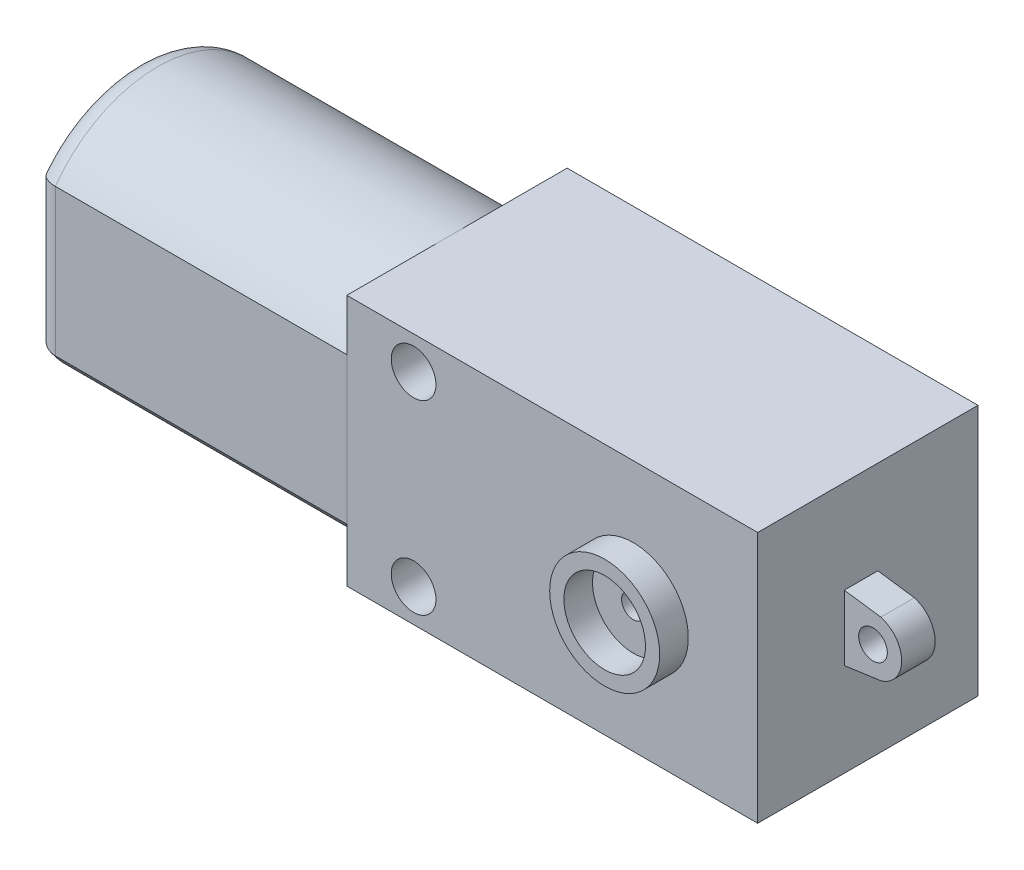
ISO-10303-21;
HEADER;
FILE_DESCRIPTION(('STEP AP214'),'2;1');
FILE_NAME('part.step','',(''),(''),'','','');
FILE_SCHEMA(('AUTOMOTIVE_DESIGN { 1 0 10303 214 1 1 1 1 }'));
ENDSEC;
DATA;
#1=APPLICATION_CONTEXT('core data for automotive mechanical design processes');
#2=APPLICATION_PROTOCOL_DEFINITION('international standard','automotive_design',2000,#1);
#3=PRODUCT_CONTEXT('',#1,'mechanical');
#4=PRODUCT('Part','Part','',(#3));
#5=PRODUCT_RELATED_PRODUCT_CATEGORY('part','',(#4));
#6=PRODUCT_DEFINITION_FORMATION('','',#4);
#7=PRODUCT_DEFINITION_CONTEXT('part definition',#1,'design');
#8=PRODUCT_DEFINITION('design','',#6,#7);
#9=PRODUCT_DEFINITION_SHAPE('','',#8);
#10=(LENGTH_UNIT() NAMED_UNIT(*) SI_UNIT(.MILLI.,.METRE.));
#11=(NAMED_UNIT(*) PLANE_ANGLE_UNIT() SI_UNIT($,.RADIAN.));
#12=(NAMED_UNIT(*) SI_UNIT($,.STERADIAN.) SOLID_ANGLE_UNIT());
#13=UNCERTAINTY_MEASURE_WITH_UNIT(LENGTH_MEASURE(1.E-05),#10,'distance_accuracy_value','');
#14=(GEOMETRIC_REPRESENTATION_CONTEXT(3) GLOBAL_UNCERTAINTY_ASSIGNED_CONTEXT((#13)) GLOBAL_UNIT_ASSIGNED_CONTEXT((#10,
#11,#12)) REPRESENTATION_CONTEXT('',''));
#15=CARTESIAN_POINT('',(0.,0.,0.));
#16=DIRECTION('',(0.,0.,1.));
#17=DIRECTION('',(1.,0.,0.));
#18=AXIS2_PLACEMENT_3D('',#15,#16,#17);
#19=CARTESIAN_POINT('',(-27.94,0.,0.));
#20=DIRECTION('',(-1.,0.,0.));
#21=DIRECTION('',(0.,0.,1.));
#22=AXIS2_PLACEMENT_3D('',#19,#20,#21);
#23=PLANE('',#22);
#24=CARTESIAN_POINT('',(-27.94,0.,0.));
#25=DIRECTION('',(-1.,0.,0.));
#26=DIRECTION('',(0.,0.,1.));
#27=AXIS2_PLACEMENT_3D('',#24,#25,#26);
#28=CIRCLE('',#27,9.1633);
#29=CARTESIAN_POINT('',(-27.94,5.83006436756919,7.0694));
#30=VERTEX_POINT('',#29);
#31=CARTESIAN_POINT('',(-27.94,5.70664266710296,-7.1694));
#32=VERTEX_POINT('',#31);
#33=EDGE_CURVE('E470',#30,#32,#28,.T.);
#34=ORIENTED_EDGE('',*,*,#33,.T.);
#35=DIRECTION('',(0.,-1.,0.));
#36=VECTOR('',#35,1.);
#37=CARTESIAN_POINT('',(-27.94,-6.36721057685389,-7.1694));
#38=LINE('',#37,#36);
#39=CARTESIAN_POINT('',(-27.94,-5.70664266710296,-7.1694));
#40=VERTEX_POINT('',#39);
#41=EDGE_CURVE('E253',#32,#40,#38,.T.);
#42=ORIENTED_EDGE('',*,*,#41,.T.);
#43=CARTESIAN_POINT('',(-27.94,0.,0.));
#44=DIRECTION('',(-1.,0.,0.));
#45=DIRECTION('',(0.,0.,1.));
#46=AXIS2_PLACEMENT_3D('',#43,#44,#45);
#47=CIRCLE('',#46,9.1633);
#48=CARTESIAN_POINT('',(-27.94,-5.83006436756919,7.0694));
#49=VERTEX_POINT('',#48);
#50=EDGE_CURVE('E462',#40,#49,#47,.T.);
#51=ORIENTED_EDGE('',*,*,#50,.T.);
#52=DIRECTION('',(0.,1.,0.));
#53=VECTOR('',#52,1.);
#54=CARTESIAN_POINT('',(-27.94,0.,7.0694));
#55=LINE('',#54,#53);
#56=EDGE_CURVE('E465',#49,#30,#55,.T.);
#57=ORIENTED_EDGE('',*,*,#56,.T.);
#58=EDGE_LOOP('',(#34,#42,#51,#57));
#59=FACE_BOUND('',#58,.T.);
#60=CARTESIAN_POINT('',(-27.94,0.,0.));
#61=DIRECTION('',(-1.,0.,0.));
#62=DIRECTION('',(0.,0.,1.));
#63=AXIS2_PLACEMENT_3D('',#60,#61,#62);
#64=CIRCLE('',#63,2.69917026626449);
#65=CARTESIAN_POINT('',(-27.94,0.,2.69917026626449));
#66=VERTEX_POINT('',#65);
#67=EDGE_CURVE('E461',#66,#66,#64,.F.);
#68=ORIENTED_EDGE('',*,*,#67,.T.);
#69=EDGE_LOOP('',(#68));
#70=FACE_BOUND('',#69,.T.);
#71=ADVANCED_FACE('F88',(#59,#70),#23,.T.);
#72=CARTESIAN_POINT('',(-27.94,0.,0.));
#73=DIRECTION('',(1.,0.,0.));
#74=DIRECTION('',(0.,0.,-1.));
#75=AXIS2_PLACEMENT_3D('',#72,#73,#74);
#76=CYLINDRICAL_SURFACE('',#75,11.1633);
#77=DIRECTION('',(1.,0.,0.));
#78=VECTOR('',#77,1.);
#79=CARTESIAN_POINT('',(-27.94,-6.50885938778831,9.0694));
#80=LINE('',#79,#78);
#81=CARTESIAN_POINT('',(-25.94,-6.50885938778831,9.0694));
#82=VERTEX_POINT('',#81);
#83=CARTESIAN_POINT('',(0.,-6.50885938778831,9.0694));
#84=VERTEX_POINT('',#83);
#85=EDGE_CURVE('E199',#82,#84,#80,.T.);
#86=ORIENTED_EDGE('',*,*,#85,.F.);
#87=CARTESIAN_POINT('',(-25.94,0.,0.));
#88=DIRECTION('',(-1.,0.,0.));
#89=DIRECTION('',(0.,0.,1.));
#90=AXIS2_PLACEMENT_3D('',#87,#88,#89);
#91=CIRCLE('',#90,11.1633);
#92=CARTESIAN_POINT('',(-25.94,-6.36721057685389,-9.1694));
#93=VERTEX_POINT('',#92);
#94=EDGE_CURVE('E12',#82,#93,#91,.F.);
#95=ORIENTED_EDGE('',*,*,#94,.T.);
#96=DIRECTION('',(1.,0.,0.));
#97=VECTOR('',#96,1.);
#98=CARTESIAN_POINT('',(-27.94,-6.36721057685389,-9.1694));
#99=LINE('',#98,#97);
#100=CARTESIAN_POINT('',(0.,-6.36721057685388,-9.1694));
#101=VERTEX_POINT('',#100);
#102=EDGE_CURVE('E249',#93,#101,#99,.T.);
#103=ORIENTED_EDGE('',*,*,#102,.T.);
#104=CARTESIAN_POINT('',(0.,0.,0.));
#105=DIRECTION('',(-1.,0.,0.));
#106=DIRECTION('',(0.,0.,1.));
#107=AXIS2_PLACEMENT_3D('',#104,#105,#106);
#108=CIRCLE('',#107,11.1633);
#109=CARTESIAN_POINT('',(0.,-11.1633,0.));
#110=VERTEX_POINT('',#109);
#111=EDGE_CURVE('E222',#101,#110,#108,.T.);
#112=ORIENTED_EDGE('',*,*,#111,.T.);
#113=EDGE_CURVE('E214',#110,#84,#108,.T.);
#114=ORIENTED_EDGE('',*,*,#113,.T.);
#115=EDGE_LOOP('',(#86,#95,#103,#112,#114));
#116=FACE_BOUND('',#115,.T.);
#117=ADVANCED_FACE('F220',(#116),#76,.T.);
#118=CARTESIAN_POINT('',(-27.94,0.,0.));
#119=DIRECTION('',(1.,0.,0.));
#120=DIRECTION('',(0.,0.,-1.));
#121=AXIS2_PLACEMENT_3D('',#118,#119,#120);
#122=CYLINDRICAL_SURFACE('',#121,11.1633);
#123=DIRECTION('',(1.,0.,0.));
#124=VECTOR('',#123,1.);
#125=CARTESIAN_POINT('',(-27.94,6.36721057685389,-9.1694));
#126=LINE('',#125,#124);
#127=CARTESIAN_POINT('',(-25.94,6.36721057685389,-9.1694));
#128=VERTEX_POINT('',#127);
#129=CARTESIAN_POINT('',(0.,6.36721057685389,-9.1694));
#130=VERTEX_POINT('',#129);
#131=EDGE_CURVE('E252',#128,#130,#126,.T.);
#132=ORIENTED_EDGE('',*,*,#131,.F.);
#133=CARTESIAN_POINT('',(-25.94,0.,0.));
#134=DIRECTION('',(-1.,0.,0.));
#135=DIRECTION('',(0.,0.,1.));
#136=AXIS2_PLACEMENT_3D('',#133,#134,#135);
#137=CIRCLE('',#136,11.1633);
#138=CARTESIAN_POINT('',(-25.94,6.50885938778831,9.0694));
#139=VERTEX_POINT('',#138);
#140=EDGE_CURVE('E117',#128,#139,#137,.F.);
#141=ORIENTED_EDGE('',*,*,#140,.T.);
#142=DIRECTION('',(1.,0.,0.));
#143=VECTOR('',#142,1.);
#144=CARTESIAN_POINT('',(-27.94,6.50885938778831,9.0694));
#145=LINE('',#144,#143);
#146=CARTESIAN_POINT('',(0.,6.50885938778831,9.0694));
#147=VERTEX_POINT('',#146);
#148=EDGE_CURVE('E463',#147,#139,#145,.F.);
#149=ORIENTED_EDGE('',*,*,#148,.F.);
#150=CARTESIAN_POINT('',(0.,0.,0.));
#151=DIRECTION('',(-1.,0.,0.));
#152=DIRECTION('',(0.,0.,1.));
#153=AXIS2_PLACEMENT_3D('',#150,#151,#152);
#154=CIRCLE('',#153,11.1633);
#155=CARTESIAN_POINT('',(0.,11.1633,0.));
#156=VERTEX_POINT('',#155);
#157=EDGE_CURVE('E217',#147,#156,#154,.T.);
#158=ORIENTED_EDGE('',*,*,#157,.T.);
#159=EDGE_CURVE('E224',#156,#130,#154,.T.);
#160=ORIENTED_EDGE('',*,*,#159,.T.);
#161=EDGE_LOOP('',(#132,#141,#149,#158,#160));
#162=FACE_BOUND('',#161,.T.);
#163=ADVANCED_FACE('F309',(#162),#122,.T.);
#164=CARTESIAN_POINT('',(36.4236,-11.1633,-10.3632));
#165=DIRECTION('',(0.,0.,-1.));
#166=DIRECTION('',(-1.,0.,0.));
#167=AXIS2_PLACEMENT_3D('',#164,#165,#166);
#168=PLANE('',#167);
#169=DIRECTION('',(0.,-1.,0.));
#170=VECTOR('',#169,1.);
#171=CARTESIAN_POINT('',(36.4236,11.1633,-10.3632));
#172=LINE('',#171,#170);
#173=CARTESIAN_POINT('',(36.4236,11.1633,-10.3632));
#174=VERTEX_POINT('',#173);
#175=CARTESIAN_POINT('',(36.4236,-11.1633,-10.3632));
#176=VERTEX_POINT('',#175);
#177=EDGE_CURVE('E524',#174,#176,#172,.T.);
#178=ORIENTED_EDGE('',*,*,#177,.T.);
#179=DIRECTION('',(-1.,0.,0.));
#180=VECTOR('',#179,1.);
#181=CARTESIAN_POINT('',(36.4236,-11.1633,-10.3632));
#182=LINE('',#181,#180);
#183=CARTESIAN_POINT('',(0.,-11.1633,-10.3632));
#184=VERTEX_POINT('',#183);
#185=EDGE_CURVE('E521',#176,#184,#182,.T.);
#186=ORIENTED_EDGE('',*,*,#185,.T.);
#187=DIRECTION('',(0.,1.,0.));
#188=VECTOR('',#187,1.);
#189=CARTESIAN_POINT('',(0.,11.1633,-10.3632));
#190=LINE('',#189,#188);
#191=CARTESIAN_POINT('',(0.,11.1633,-10.3632));
#192=VERTEX_POINT('',#191);
#193=EDGE_CURVE('E515',#184,#192,#190,.T.);
#194=ORIENTED_EDGE('',*,*,#193,.T.);
#195=DIRECTION('',(1.,0.,0.));
#196=VECTOR('',#195,1.);
#197=CARTESIAN_POINT('',(36.4236,11.1633,-10.3632));
#198=LINE('',#197,#196);
#199=EDGE_CURVE('E491',#192,#174,#198,.T.);
#200=ORIENTED_EDGE('',*,*,#199,.T.);
#201=EDGE_LOOP('',(#178,#186,#194,#200));
#202=FACE_BOUND('',#201,.T.);
#203=CARTESIAN_POINT('',(25.4,0.,-10.3632));
#204=DIRECTION('',(0.,0.,-1.));
#205=DIRECTION('',(-1.,0.,0.));
#206=AXIS2_PLACEMENT_3D('',#203,#204,#205);
#207=CIRCLE('',#206,1.0414);
#208=CARTESIAN_POINT('',(24.3586,0.,-10.3632));
#209=VERTEX_POINT('',#208);
#210=EDGE_CURVE('E528',#209,#209,#207,.F.);
#211=ORIENTED_EDGE('',*,*,#210,.T.);
#212=EDGE_LOOP('',(#211));
#213=FACE_BOUND('',#212,.T.);
#214=CARTESIAN_POINT('',(5.9182,8.2423,-10.3632));
#215=DIRECTION('',(0.,0.,-1.));
#216=DIRECTION('',(-1.,0.,0.));
#217=AXIS2_PLACEMENT_3D('',#214,#215,#216);
#218=CIRCLE('',#217,1.9812);
#219=CARTESIAN_POINT('',(3.937,8.2423,-10.3632));
#220=VERTEX_POINT('',#219);
#221=EDGE_CURVE('E534',#220,#220,#218,.F.);
#222=ORIENTED_EDGE('',*,*,#221,.T.);
#223=EDGE_LOOP('',(#222));
#224=FACE_BOUND('',#223,.T.);
#225=CARTESIAN_POINT('',(5.9182,-8.2423,-10.3632));
#226=DIRECTION('',(0.,0.,-1.));
#227=DIRECTION('',(-1.,0.,0.));
#228=AXIS2_PLACEMENT_3D('',#225,#226,#227);
#229=CIRCLE('',#228,1.9812);
#230=CARTESIAN_POINT('',(3.937,-8.2423,-10.3632));
#231=VERTEX_POINT('',#230);
#232=EDGE_CURVE('E538',#231,#231,#229,.F.);
#233=ORIENTED_EDGE('',*,*,#232,.T.);
#234=EDGE_LOOP('',(#233));
#235=FACE_BOUND('',#234,.T.);
#236=CARTESIAN_POINT('',(14.5542,0.,-10.3632));
#237=DIRECTION('',(0.,0.,-1.));
#238=DIRECTION('',(-1.,0.,0.));
#239=AXIS2_PLACEMENT_3D('',#236,#237,#238);
#240=CIRCLE('',#239,1.8542);
#241=CARTESIAN_POINT('',(12.7,0.,-10.3632));
#242=VERTEX_POINT('',#241);
#243=EDGE_CURVE('E206',#242,#242,#240,.T.);
#244=ORIENTED_EDGE('',*,*,#243,.F.);
#245=EDGE_LOOP('',(#244));
#246=FACE_BOUND('',#245,.T.);
#247=ADVANCED_FACE('F317',(#202,#213,#224,#235,#246),#168,.T.);
#248=CARTESIAN_POINT('',(36.4236,11.1633,-9.1694));
#249=DIRECTION('',(0.,0.,1.));
#250=DIRECTION('',(1.,0.,0.));
#251=AXIS2_PLACEMENT_3D('',#248,#249,#250);
#252=PLANE('',#251);
#253=ORIENTED_EDGE('',*,*,#102,.F.);
#254=DIRECTION('',(0.,-1.,0.));
#255=VECTOR('',#254,1.);
#256=CARTESIAN_POINT('',(-25.94,6.36721057685389,-9.1694));
#257=LINE('',#256,#255);
#258=EDGE_CURVE('E257',#93,#128,#257,.F.);
#259=ORIENTED_EDGE('',*,*,#258,.T.);
#260=ORIENTED_EDGE('',*,*,#131,.T.);
#261=DIRECTION('',(0.,1.,0.));
#262=VECTOR('',#261,1.);
#263=CARTESIAN_POINT('',(0.,11.1633,-9.1694));
#264=LINE('',#263,#262);
#265=EDGE_CURVE('E227',#101,#130,#264,.T.);
#266=ORIENTED_EDGE('',*,*,#265,.F.);
#267=EDGE_LOOP('',(#253,#259,#260,#266));
#268=FACE_BOUND('',#267,.T.);
#269=ADVANCED_FACE('F332',(#268),#252,.F.);
#270=CARTESIAN_POINT('',(36.4236,11.1633,9.1694));
#271=DIRECTION('',(0.,0.,-1.));
#272=DIRECTION('',(-1.,0.,0.));
#273=AXIS2_PLACEMENT_3D('',#270,#271,#272);
#274=PLANE('',#273);
#275=CARTESIAN_POINT('',(5.9182,-8.2423,9.1694));
#276=DIRECTION('',(0.,0.,1.));
#277=DIRECTION('',(1.,0.,0.));
#278=AXIS2_PLACEMENT_3D('',#275,#276,#277);
#279=CIRCLE('',#278,1.9812);
#280=CARTESIAN_POINT('',(7.8994,-8.2423,9.1694));
#281=VERTEX_POINT('',#280);
#282=EDGE_CURVE('E366',#281,#281,#279,.T.);
#283=ORIENTED_EDGE('',*,*,#282,.F.);
#284=EDGE_LOOP('',(#283));
#285=FACE_BOUND('',#284,.T.);
#286=CARTESIAN_POINT('',(5.9182,8.2423,9.1694));
#287=DIRECTION('',(0.,0.,1.));
#288=DIRECTION('',(1.,0.,0.));
#289=AXIS2_PLACEMENT_3D('',#286,#287,#288);
#290=CIRCLE('',#289,1.9812);
#291=CARTESIAN_POINT('',(7.8994,8.2423,9.1694));
#292=VERTEX_POINT('',#291);
#293=EDGE_CURVE('E370',#292,#292,#290,.T.);
#294=ORIENTED_EDGE('',*,*,#293,.F.);
#295=EDGE_LOOP('',(#294));
#296=FACE_BOUND('',#295,.T.);
#297=DIRECTION('',(0.,-1.,0.));
#298=VECTOR('',#297,1.);
#299=CARTESIAN_POINT('',(0.,11.1633,9.1694));
#300=LINE('',#299,#298);
#301=CARTESIAN_POINT('',(0.,11.1633,9.1694));
#302=VERTEX_POINT('',#301);
#303=CARTESIAN_POINT('',(0.,-11.1633,9.1694));
#304=VERTEX_POINT('',#303);
#305=EDGE_CURVE('E256',#302,#304,#300,.T.);
#306=ORIENTED_EDGE('',*,*,#305,.T.);
#307=DIRECTION('',(-1.,0.,0.));
#308=VECTOR('',#307,1.);
#309=CARTESIAN_POINT('',(36.4236,-11.1633,9.1694));
#310=LINE('',#309,#308);
#311=CARTESIAN_POINT('',(36.4236,-11.1633,9.1694));
#312=VERTEX_POINT('',#311);
#313=EDGE_CURVE('E230',#312,#304,#310,.T.);
#314=ORIENTED_EDGE('',*,*,#313,.F.);
#315=DIRECTION('',(0.,-1.,0.));
#316=VECTOR('',#315,1.);
#317=CARTESIAN_POINT('',(36.4236,11.1633,9.1694));
#318=LINE('',#317,#316);
#319=CARTESIAN_POINT('',(36.4236,11.1633,9.1694));
#320=VERTEX_POINT('',#319);
#321=EDGE_CURVE('E804',#320,#312,#318,.T.);
#322=ORIENTED_EDGE('',*,*,#321,.F.);
#323=DIRECTION('',(-1.,0.,0.));
#324=VECTOR('',#323,1.);
#325=CARTESIAN_POINT('',(36.4236,11.1633,9.1694));
#326=LINE('',#325,#324);
#327=EDGE_CURVE('E818',#320,#302,#326,.T.);
#328=ORIENTED_EDGE('',*,*,#327,.T.);
#329=EDGE_LOOP('',(#306,#314,#322,#328));
#330=FACE_BOUND('',#329,.T.);
#331=CARTESIAN_POINT('',(25.4,0.,9.1694));
#332=DIRECTION('',(0.,0.,-1.));
#333=DIRECTION('',(-1.,0.,0.));
#334=AXIS2_PLACEMENT_3D('',#331,#332,#333);
#335=CIRCLE('',#334,4.8768);
#336=CARTESIAN_POINT('',(20.5232,0.,9.1694));
#337=VERTEX_POINT('',#336);
#338=EDGE_CURVE('E223',#337,#337,#335,.F.);
#339=ORIENTED_EDGE('',*,*,#338,.F.);
#340=EDGE_LOOP('',(#339));
#341=FACE_BOUND('',#340,.T.);
#342=ADVANCED_FACE('F335',(#285,#296,#330,#341),#274,.F.);
#343=CARTESIAN_POINT('',(41.5036,2.8956,1.48589999999999));
#344=DIRECTION('',(0.,0.,-1.));
#345=DIRECTION('',(0.,1.,0.));
#346=AXIS2_PLACEMENT_3D('',#343,#344,#345);
#347=PLANE('',#346);
#348=CARTESIAN_POINT('',(38.9636,0.,1.48589999999999));
#349=DIRECTION('',(0.,0.,1.));
#350=DIRECTION('',(1.,0.,0.));
#351=AXIS2_PLACEMENT_3D('',#348,#349,#350);
#352=CIRCLE('',#351,1.27);
#353=CARTESIAN_POINT('',(40.2336,0.,1.48589999999999));
#354=VERTEX_POINT('',#353);
#355=EDGE_CURVE('E422',#354,#354,#352,.T.);
#356=ORIENTED_EDGE('',*,*,#355,.F.);
#357=EDGE_LOOP('',(#356));
#358=FACE_BOUND('',#357,.T.);
#359=CARTESIAN_POINT('',(38.9636,0.,1.48589999999999));
#360=DIRECTION('',(0.,0.,1.));
#361=DIRECTION('',(1.,0.,0.));
#362=AXIS2_PLACEMENT_3D('',#359,#360,#361);
#363=CIRCLE('',#362,2.54);
#364=CARTESIAN_POINT('',(39.6611284425265,-2.44234601804629,1.48589999999999));
#365=VERTEX_POINT('',#364);
#366=CARTESIAN_POINT('',(39.6611284425265,2.44234601804629,1.48589999999999));
#367=VERTEX_POINT('',#366);
#368=EDGE_CURVE('E432',#365,#367,#363,.T.);
#369=ORIENTED_EDGE('',*,*,#368,.T.);
#370=DIRECTION('',(-0.99034174667433,0.138647844534405,0.));
#371=VECTOR('',#370,1.);
#372=CARTESIAN_POINT('',(40.1545285708169,2.37327000008564,1.48589999999999));
#373=LINE('',#372,#371);
#374=CARTESIAN_POINT('',(36.4236,2.8956,1.48589999999999));
#375=VERTEX_POINT('',#374);
#376=EDGE_CURVE('E425',#367,#375,#373,.T.);
#377=ORIENTED_EDGE('',*,*,#376,.T.);
#378=DIRECTION('',(0.,-1.,0.));
#379=VECTOR('',#378,1.);
#380=CARTESIAN_POINT('',(36.4236,2.8956,1.48589999999999));
#381=LINE('',#380,#379);
#382=CARTESIAN_POINT('',(36.4236,-2.8956,1.48589999999999));
#383=VERTEX_POINT('',#382);
#384=EDGE_CURVE('E442',#375,#383,#381,.T.);
#385=ORIENTED_EDGE('',*,*,#384,.T.);
#386=DIRECTION('',(-0.99034174667433,-0.138647844534406,0.));
#387=VECTOR('',#386,1.);
#388=CARTESIAN_POINT('',(38.4701998717096,-2.60907601796066,1.48589999999999));
#389=LINE('',#388,#387);
#390=EDGE_CURVE('E438',#365,#383,#389,.T.);
#391=ORIENTED_EDGE('',*,*,#390,.F.);
#392=EDGE_LOOP('',(#369,#377,#385,#391));
#393=FACE_BOUND('',#392,.T.);
#394=ADVANCED_FACE('F357',(#358,#393),#347,.F.);
#395=CARTESIAN_POINT('',(41.5036,2.8956,-1.48590000000001));
#396=DIRECTION('',(0.,0.,1.));
#397=DIRECTION('',(0.,-1.,0.));
#398=AXIS2_PLACEMENT_3D('',#395,#396,#397);
#399=PLANE('',#398);
#400=CARTESIAN_POINT('',(38.9636,0.,-1.48590000000001));
#401=DIRECTION('',(0.,0.,1.));
#402=DIRECTION('',(0.,-1.,0.));
#403=AXIS2_PLACEMENT_3D('',#400,#401,#402);
#404=CIRCLE('',#403,1.27);
#405=CARTESIAN_POINT('',(38.9636,-1.27,-1.4859));
#406=VERTEX_POINT('',#405);
#407=EDGE_CURVE('E410',#406,#406,#404,.F.);
#408=ORIENTED_EDGE('',*,*,#407,.F.);
#409=EDGE_LOOP('',(#408));
#410=FACE_BOUND('',#409,.T.);
#411=DIRECTION('',(0.99034174667433,-0.138647844534405,0.));
#412=VECTOR('',#411,1.);
#413=CARTESIAN_POINT('',(40.1545285708169,2.37327000008564,-1.48590000000001));
#414=LINE('',#413,#412);
#415=CARTESIAN_POINT('',(36.4236,2.8956,-1.48590000000001));
#416=VERTEX_POINT('',#415);
#417=CARTESIAN_POINT('',(39.6611284425265,2.44234601804629,-1.48590000000001));
#418=VERTEX_POINT('',#417);
#419=EDGE_CURVE('E414',#416,#418,#414,.T.);
#420=ORIENTED_EDGE('',*,*,#419,.T.);
#421=CARTESIAN_POINT('',(38.9636,0.,-1.48590000000001));
#422=DIRECTION('',(0.,0.,1.));
#423=DIRECTION('',(0.,-1.,0.));
#424=AXIS2_PLACEMENT_3D('',#421,#422,#423);
#425=CIRCLE('',#424,2.54);
#426=CARTESIAN_POINT('',(39.6611284425265,-2.44234601804629,-1.4859));
#427=VERTEX_POINT('',#426);
#428=EDGE_CURVE('E416',#418,#427,#425,.F.);
#429=ORIENTED_EDGE('',*,*,#428,.T.);
#430=DIRECTION('',(0.99034174667433,0.138647844534406,0.));
#431=VECTOR('',#430,1.);
#432=CARTESIAN_POINT('',(38.4701998717096,-2.60907601796066,-1.4859));
#433=LINE('',#432,#431);
#434=CARTESIAN_POINT('',(36.4236,-2.8956,-1.4859));
#435=VERTEX_POINT('',#434);
#436=EDGE_CURVE('E435',#435,#427,#433,.T.);
#437=ORIENTED_EDGE('',*,*,#436,.F.);
#438=DIRECTION('',(0.,1.,0.));
#439=VECTOR('',#438,1.);
#440=CARTESIAN_POINT('',(36.4236,2.8956,-1.48590000000001));
#441=LINE('',#440,#439);
#442=EDGE_CURVE('E418',#435,#416,#441,.T.);
#443=ORIENTED_EDGE('',*,*,#442,.T.);
#444=EDGE_LOOP('',(#420,#429,#437,#443));
#445=FACE_BOUND('',#444,.T.);
#446=ADVANCED_FACE('F322',(#410,#445),#399,.F.);
#447=CARTESIAN_POINT('',(36.4236,-11.1633,9.1694));
#448=DIRECTION('',(1.,0.,0.));
#449=DIRECTION('',(0.,0.,-1.));
#450=AXIS2_PLACEMENT_3D('',#447,#448,#449);
#451=PLANE('',#450);
#452=ORIENTED_EDGE('',*,*,#321,.T.);
#453=DIRECTION('',(0.,0.,-1.));
#454=VECTOR('',#453,1.);
#455=CARTESIAN_POINT('',(36.4236,-11.1633,9.1694));
#456=LINE('',#455,#454);
#457=EDGE_CURVE('E802',#312,#176,#456,.T.);
#458=ORIENTED_EDGE('',*,*,#457,.T.);
#459=ORIENTED_EDGE('',*,*,#177,.F.);
#460=DIRECTION('',(0.,0.,1.));
#461=VECTOR('',#460,1.);
#462=CARTESIAN_POINT('',(36.4236,11.1633,9.1694));
#463=LINE('',#462,#461);
#464=EDGE_CURVE('E800',#174,#320,#463,.T.);
#465=ORIENTED_EDGE('',*,*,#464,.T.);
#466=EDGE_LOOP('',(#452,#458,#459,#465));
#467=FACE_BOUND('',#466,.T.);
#468=DIRECTION('',(0.,0.,-1.));
#469=VECTOR('',#468,1.);
#470=CARTESIAN_POINT('',(36.4236,-2.8956,1.4859));
#471=LINE('',#470,#469);
#472=EDGE_CURVE('E445',#383,#435,#471,.T.);
#473=ORIENTED_EDGE('',*,*,#472,.F.);
#474=ORIENTED_EDGE('',*,*,#384,.F.);
#475=DIRECTION('',(0.,0.,1.));
#476=VECTOR('',#475,1.);
#477=CARTESIAN_POINT('',(36.4236,2.8956,1.48589999999999));
#478=LINE('',#477,#476);
#479=EDGE_CURVE('E447',#416,#375,#478,.T.);
#480=ORIENTED_EDGE('',*,*,#479,.F.);
#481=ORIENTED_EDGE('',*,*,#442,.F.);
#482=EDGE_LOOP('',(#473,#474,#480,#481));
#483=FACE_BOUND('',#482,.T.);
#484=ADVANCED_FACE('F319',(#467,#483),#451,.T.);
#485=CARTESIAN_POINT('',(0.,-11.1633,9.1694));
#486=DIRECTION('',(1.,0.,0.));
#487=DIRECTION('',(0.,0.,-1.));
#488=AXIS2_PLACEMENT_3D('',#485,#486,#487);
#489=PLANE('',#488);
#490=ORIENTED_EDGE('',*,*,#305,.F.);
#491=DIRECTION('',(0.,0.,1.));
#492=VECTOR('',#491,1.);
#493=CARTESIAN_POINT('',(0.,11.1633,9.1694));
#494=LINE('',#493,#492);
#495=EDGE_CURVE('E810',#156,#302,#494,.T.);
#496=ORIENTED_EDGE('',*,*,#495,.F.);
#497=ORIENTED_EDGE('',*,*,#157,.F.);
#498=DIRECTION('',(0.,1.,0.));
#499=VECTOR('',#498,1.);
#500=CARTESIAN_POINT('',(0.,16.0531211793792,9.0694));
#501=LINE('',#500,#499);
#502=EDGE_CURVE('E202',#84,#147,#501,.T.);
#503=ORIENTED_EDGE('',*,*,#502,.F.);
#504=ORIENTED_EDGE('',*,*,#113,.F.);
#505=DIRECTION('',(0.,0.,-1.));
#506=VECTOR('',#505,1.);
#507=CARTESIAN_POINT('',(0.,-11.1633,9.1694));
#508=LINE('',#507,#506);
#509=EDGE_CURVE('E808',#304,#110,#508,.T.);
#510=ORIENTED_EDGE('',*,*,#509,.F.);
#511=EDGE_LOOP('',(#490,#496,#497,#503,#504,#510));
#512=FACE_BOUND('',#511,.T.);
#513=ADVANCED_FACE('F212',(#512),#489,.F.);
#514=ORIENTED_EDGE('',*,*,#159,.F.);
#515=EDGE_CURVE('E815',#192,#156,#494,.T.);
#516=ORIENTED_EDGE('',*,*,#515,.F.);
#517=ORIENTED_EDGE('',*,*,#193,.F.);
#518=EDGE_CURVE('E807',#110,#184,#508,.T.);
#519=ORIENTED_EDGE('',*,*,#518,.F.);
#520=ORIENTED_EDGE('',*,*,#111,.F.);
#521=ORIENTED_EDGE('',*,*,#265,.T.);
#522=EDGE_LOOP('',(#514,#516,#517,#519,#520,#521));
#523=FACE_BOUND('',#522,.T.);
#524=ADVANCED_FACE('F326',(#523),#489,.F.);
#525=CARTESIAN_POINT('',(36.4236,-11.1633,9.1694));
#526=DIRECTION('',(0.,1.,0.));
#527=DIRECTION('',(0.,0.,1.));
#528=AXIS2_PLACEMENT_3D('',#525,#526,#527);
#529=PLANE('',#528);
#530=ORIENTED_EDGE('',*,*,#509,.T.);
#531=ORIENTED_EDGE('',*,*,#518,.T.);
#532=ORIENTED_EDGE('',*,*,#185,.F.);
#533=ORIENTED_EDGE('',*,*,#457,.F.);
#534=ORIENTED_EDGE('',*,*,#313,.T.);
#535=EDGE_LOOP('',(#530,#531,#532,#533,#534));
#536=FACE_BOUND('',#535,.T.);
#537=ADVANCED_FACE('F330',(#536),#529,.F.);
#538=CARTESIAN_POINT('',(36.4236,11.1633,9.1694));
#539=DIRECTION('',(0.,-1.,0.));
#540=DIRECTION('',(0.,0.,-1.));
#541=AXIS2_PLACEMENT_3D('',#538,#539,#540);
#542=PLANE('',#541);
#543=ORIENTED_EDGE('',*,*,#515,.T.);
#544=ORIENTED_EDGE('',*,*,#495,.T.);
#545=ORIENTED_EDGE('',*,*,#327,.F.);
#546=ORIENTED_EDGE('',*,*,#464,.F.);
#547=ORIENTED_EDGE('',*,*,#199,.F.);
#548=EDGE_LOOP('',(#543,#544,#545,#546,#547));
#549=FACE_BOUND('',#548,.T.);
#550=ADVANCED_FACE('F327',(#549),#542,.F.);
#551=CARTESIAN_POINT('',(-28.8798,0.,0.));
#552=DIRECTION('',(-1.,0.,0.));
#553=DIRECTION('',(0.,0.,1.));
#554=AXIS2_PLACEMENT_3D('',#551,#552,#553);
#555=PLANE('',#554);
#556=CARTESIAN_POINT('',(-28.8798,0.,0.));
#557=DIRECTION('',(-1.,0.,0.));
#558=DIRECTION('',(0.,0.,1.));
#559=AXIS2_PLACEMENT_3D('',#556,#557,#558);
#560=CIRCLE('',#559,1.0033);
#561=CARTESIAN_POINT('',(-28.8798,0.,1.0033));
#562=VERTEX_POINT('',#561);
#563=EDGE_CURVE('E240',#562,#562,#560,.T.);
#564=ORIENTED_EDGE('',*,*,#563,.T.);
#565=EDGE_LOOP('',(#564));
#566=FACE_BOUND('',#565,.T.);
#567=ADVANCED_FACE('F314',(#566),#555,.T.);
#568=CARTESIAN_POINT('',(38.9636,0.,-7.33319846681355));
#569=DIRECTION('',(0.,0.,1.));
#570=DIRECTION('',(1.,0.,0.));
#571=AXIS2_PLACEMENT_3D('',#568,#569,#570);
#572=CYLINDRICAL_SURFACE('',#571,2.54);
#573=ORIENTED_EDGE('',*,*,#428,.F.);
#574=DIRECTION('',(0.,0.,1.));
#575=VECTOR('',#574,1.);
#576=CARTESIAN_POINT('',(39.6611284425265,2.44234601804629,-7.33319846681355));
#577=LINE('',#576,#575);
#578=EDGE_CURVE('E421',#418,#367,#577,.T.);
#579=ORIENTED_EDGE('',*,*,#578,.T.);
#580=ORIENTED_EDGE('',*,*,#368,.F.);
#581=DIRECTION('',(0.,0.,1.));
#582=VECTOR('',#581,1.);
#583=CARTESIAN_POINT('',(39.6611284425265,-2.44234601804629,-7.33319846681355));
#584=LINE('',#583,#582);
#585=EDGE_CURVE('E436',#427,#365,#584,.T.);
#586=ORIENTED_EDGE('',*,*,#585,.F.);
#587=EDGE_LOOP('',(#573,#579,#580,#586));
#588=FACE_BOUND('',#587,.T.);
#589=ADVANCED_FACE('F396',(#588),#572,.T.);
#590=CARTESIAN_POINT('',(38.4701998717096,-2.60907601796066,-7.33319846681355));
#591=DIRECTION('',(-0.138647844534406,0.99034174667433,0.));
#592=DIRECTION('',(-0.99034174667433,-0.138647844534406,0.));
#593=AXIS2_PLACEMENT_3D('',#590,#591,#592);
#594=PLANE('',#593);
#595=ORIENTED_EDGE('',*,*,#436,.T.);
#596=ORIENTED_EDGE('',*,*,#585,.T.);
#597=ORIENTED_EDGE('',*,*,#390,.T.);
#598=ORIENTED_EDGE('',*,*,#472,.T.);
#599=EDGE_LOOP('',(#595,#596,#597,#598));
#600=FACE_BOUND('',#599,.T.);
#601=ADVANCED_FACE('F394',(#600),#594,.F.);
#602=CARTESIAN_POINT('',(40.1545285708169,2.37327000008564,-7.33319846681355));
#603=DIRECTION('',(0.138647844534405,0.990341746674331,0.));
#604=DIRECTION('',(-0.99034174667433,0.138647844534405,0.));
#605=AXIS2_PLACEMENT_3D('',#602,#603,#604);
#606=PLANE('',#605);
#607=ORIENTED_EDGE('',*,*,#479,.T.);
#608=ORIENTED_EDGE('',*,*,#376,.F.);
#609=ORIENTED_EDGE('',*,*,#578,.F.);
#610=ORIENTED_EDGE('',*,*,#419,.F.);
#611=EDGE_LOOP('',(#607,#608,#609,#610));
#612=FACE_BOUND('',#611,.T.);
#613=ADVANCED_FACE('F390',(#612),#606,.T.);
#614=CARTESIAN_POINT('',(38.9636,0.,-7.33319846681355));
#615=DIRECTION('',(0.,0.,1.));
#616=DIRECTION('',(1.,0.,0.));
#617=AXIS2_PLACEMENT_3D('',#614,#615,#616);
#618=CYLINDRICAL_SURFACE('',#617,1.27);
#619=ORIENTED_EDGE('',*,*,#407,.T.);
#620=EDGE_LOOP('',(#619));
#621=FACE_BOUND('',#620,.T.);
#622=ORIENTED_EDGE('',*,*,#355,.T.);
#623=EDGE_LOOP('',(#622));
#624=FACE_BOUND('',#623,.T.);
#625=ADVANCED_FACE('F383',(#621,#624),#618,.F.);
#626=CARTESIAN_POINT('',(25.4,0.,11.7094));
#627=DIRECTION('',(0.,0.,1.));
#628=DIRECTION('',(1.,0.,0.));
#629=AXIS2_PLACEMENT_3D('',#626,#627,#628);
#630=PLANE('',#629);
#631=CARTESIAN_POINT('',(25.4,0.,11.7094));
#632=DIRECTION('',(0.,0.,1.));
#633=DIRECTION('',(1.,0.,0.));
#634=AXIS2_PLACEMENT_3D('',#631,#632,#633);
#635=CIRCLE('',#634,4.8768);
#636=CARTESIAN_POINT('',(30.2768,0.,11.7094));
#637=VERTEX_POINT('',#636);
#638=EDGE_CURVE('E496',#637,#637,#635,.T.);
#639=ORIENTED_EDGE('',*,*,#638,.T.);
#640=EDGE_LOOP('',(#639));
#641=FACE_BOUND('',#640,.T.);
#642=CARTESIAN_POINT('',(25.4,0.,11.7094));
#643=DIRECTION('',(0.,0.,1.));
#644=DIRECTION('',(1.,0.,0.));
#645=AXIS2_PLACEMENT_3D('',#642,#643,#644);
#646=CIRCLE('',#645,3.6195);
#647=CARTESIAN_POINT('',(29.0195,0.,11.7094));
#648=VERTEX_POINT('',#647);
#649=EDGE_CURVE('E493',#648,#648,#646,.T.);
#650=ORIENTED_EDGE('',*,*,#649,.F.);
#651=EDGE_LOOP('',(#650));
#652=FACE_BOUND('',#651,.T.);
#653=ADVANCED_FACE('F377',(#641,#652),#630,.T.);
#654=CARTESIAN_POINT('',(25.4,0.,11.7094));
#655=DIRECTION('',(0.,0.,-1.));
#656=DIRECTION('',(-1.,0.,0.));
#657=AXIS2_PLACEMENT_3D('',#654,#655,#656);
#658=CYLINDRICAL_SURFACE('',#657,4.8768);
#659=ORIENTED_EDGE('',*,*,#638,.F.);
#660=EDGE_LOOP('',(#659));
#661=FACE_BOUND('',#660,.T.);
#662=ORIENTED_EDGE('',*,*,#338,.T.);
#663=EDGE_LOOP('',(#662));
#664=FACE_BOUND('',#663,.T.);
#665=ADVANCED_FACE('F351',(#661,#664),#658,.T.);
#666=CARTESIAN_POINT('',(25.4,0.,11.7094));
#667=DIRECTION('',(0.,0.,-1.));
#668=DIRECTION('',(-1.,0.,0.));
#669=AXIS2_PLACEMENT_3D('',#666,#667,#668);
#670=CYLINDRICAL_SURFACE('',#669,3.6195);
#671=ORIENTED_EDGE('',*,*,#649,.T.);
#672=EDGE_LOOP('',(#671));
#673=FACE_BOUND('',#672,.T.);
#674=CARTESIAN_POINT('',(25.4,0.,9.1694));
#675=DIRECTION('',(0.,0.,1.));
#676=DIRECTION('',(1.,0.,0.));
#677=AXIS2_PLACEMENT_3D('',#674,#675,#676);
#678=CIRCLE('',#677,3.6195);
#679=CARTESIAN_POINT('',(29.0195,0.,9.1694));
#680=VERTEX_POINT('',#679);
#681=EDGE_CURVE('E497',#680,#680,#678,.T.);
#682=ORIENTED_EDGE('',*,*,#681,.F.);
#683=EDGE_LOOP('',(#682));
#684=FACE_BOUND('',#683,.T.);
#685=ADVANCED_FACE('F342',(#673,#684),#670,.F.);
#686=CARTESIAN_POINT('',(25.4,0.,9.1694));
#687=DIRECTION('',(0.,0.,1.));
#688=DIRECTION('',(1.,0.,0.));
#689=AXIS2_PLACEMENT_3D('',#686,#687,#688);
#690=CIRCLE('',#689,1.0414);
#691=CARTESIAN_POINT('',(26.4414,0.,9.1694));
#692=VERTEX_POINT('',#691);
#693=EDGE_CURVE('E531',#692,#692,#690,.T.);
#694=ORIENTED_EDGE('',*,*,#693,.F.);
#695=EDGE_LOOP('',(#694));
#696=FACE_BOUND('',#695,.T.);
#697=ORIENTED_EDGE('',*,*,#681,.T.);
#698=EDGE_LOOP('',(#697));
#699=FACE_BOUND('',#698,.T.);
#700=ADVANCED_FACE('F339',(#696,#699),#274,.F.);
#701=CARTESIAN_POINT('',(25.4,0.,-15.9668798195471));
#702=DIRECTION('',(0.,0.,1.));
#703=DIRECTION('',(1.,0.,0.));
#704=AXIS2_PLACEMENT_3D('',#701,#702,#703);
#705=CYLINDRICAL_SURFACE('',#704,1.0414);
#706=ORIENTED_EDGE('',*,*,#693,.T.);
#707=EDGE_LOOP('',(#706));
#708=FACE_BOUND('',#707,.T.);
#709=ORIENTED_EDGE('',*,*,#210,.F.);
#710=EDGE_LOOP('',(#709));
#711=FACE_BOUND('',#710,.T.);
#712=ADVANCED_FACE('F341',(#708,#711),#705,.F.);
#713=CARTESIAN_POINT('',(5.9182,8.2423,-15.9668798195471));
#714=DIRECTION('',(0.,0.,1.));
#715=DIRECTION('',(1.,0.,0.));
#716=AXIS2_PLACEMENT_3D('',#713,#714,#715);
#717=CYLINDRICAL_SURFACE('',#716,1.9812);
#718=ORIENTED_EDGE('',*,*,#293,.T.);
#719=EDGE_LOOP('',(#718));
#720=FACE_BOUND('',#719,.T.);
#721=ORIENTED_EDGE('',*,*,#221,.F.);
#722=EDGE_LOOP('',(#721));
#723=FACE_BOUND('',#722,.T.);
#724=ADVANCED_FACE('F348',(#720,#723),#717,.F.);
#725=CARTESIAN_POINT('',(5.9182,-8.2423,-15.9668798195471));
#726=DIRECTION('',(0.,0.,1.));
#727=DIRECTION('',(1.,0.,0.));
#728=AXIS2_PLACEMENT_3D('',#725,#726,#727);
#729=CYLINDRICAL_SURFACE('',#728,1.9812);
#730=ORIENTED_EDGE('',*,*,#282,.T.);
#731=EDGE_LOOP('',(#730));
#732=FACE_BOUND('',#731,.T.);
#733=ORIENTED_EDGE('',*,*,#232,.F.);
#734=EDGE_LOOP('',(#733));
#735=FACE_BOUND('',#734,.T.);
#736=ADVANCED_FACE('F552',(#732,#735),#729,.F.);
#737=CARTESIAN_POINT('',(14.5542,0.,-12.1158));
#738=DIRECTION('',(0.,0.,1.));
#739=DIRECTION('',(1.,0.,0.));
#740=AXIS2_PLACEMENT_3D('',#737,#738,#739);
#741=CYLINDRICAL_SURFACE('',#740,1.8542);
#742=CARTESIAN_POINT('',(14.5542,0.,-12.1158));
#743=DIRECTION('',(0.,0.,-1.));
#744=DIRECTION('',(-1.,0.,0.));
#745=AXIS2_PLACEMENT_3D('',#742,#743,#744);
#746=CIRCLE('',#745,1.8542);
#747=CARTESIAN_POINT('',(12.7,0.,-12.1158));
#748=VERTEX_POINT('',#747);
#749=EDGE_CURVE('E542',#748,#748,#746,.T.);
#750=ORIENTED_EDGE('',*,*,#749,.F.);
#751=EDGE_LOOP('',(#750));
#752=FACE_BOUND('',#751,.T.);
#753=ORIENTED_EDGE('',*,*,#243,.T.);
#754=EDGE_LOOP('',(#753));
#755=FACE_BOUND('',#754,.T.);
#756=ADVANCED_FACE('F549',(#752,#755),#741,.T.);
#757=CARTESIAN_POINT('',(14.5542,0.,-12.1158));
#758=DIRECTION('',(0.,0.,-1.));
#759=DIRECTION('',(-1.,0.,0.));
#760=AXIS2_PLACEMENT_3D('',#757,#758,#759);
#761=PLANE('',#760);
#762=ORIENTED_EDGE('',*,*,#749,.T.);
#763=EDGE_LOOP('',(#762));
#764=FACE_BOUND('',#763,.T.);
#765=ADVANCED_FACE('F301',(#764),#761,.T.);
#766=CARTESIAN_POINT('',(-30.65384668237,-11.1633,9.0694));
#767=DIRECTION('',(0.,0.,1.));
#768=DIRECTION('',(1.,0.,0.));
#769=AXIS2_PLACEMENT_3D('',#766,#767,#768);
#770=PLANE('',#769);
#771=ORIENTED_EDGE('',*,*,#148,.T.);
#772=DIRECTION('',(0.,1.,0.));
#773=VECTOR('',#772,1.);
#774=CARTESIAN_POINT('',(-25.94,-11.1633,9.0694));
#775=LINE('',#774,#773);
#776=EDGE_CURVE('E102',#139,#82,#775,.F.);
#777=ORIENTED_EDGE('',*,*,#776,.T.);
#778=ORIENTED_EDGE('',*,*,#85,.T.);
#779=ORIENTED_EDGE('',*,*,#502,.T.);
#780=EDGE_LOOP('',(#771,#777,#778,#779));
#781=FACE_BOUND('',#780,.T.);
#782=ADVANCED_FACE('F201',(#781),#770,.T.);
#783=CARTESIAN_POINT('',(-25.94,0.,7.0694));
#784=DIRECTION('',(0.,1.,0.));
#785=DIRECTION('',(0.,0.,1.));
#786=AXIS2_PLACEMENT_3D('',#783,#784,#785);
#787=CYLINDRICAL_SURFACE('',#786,2.);
#788=CARTESIAN_POINT('',(-25.94,-6.50885938778831,9.0694));
#789=CARTESIAN_POINT('',(-25.9942592139329,-6.50885932579173,9.06940097808151));
#790=CARTESIAN_POINT('',(-26.0484917711275,-6.50814861758597,9.06719045017334));
#791=CARTESIAN_POINT('',(-26.1565546495076,-6.50531376633826,9.05838077776603));
#792=CARTESIAN_POINT('',(-26.2103850247592,-6.50318981686915,9.05178223429715));
#793=CARTESIAN_POINT('',(-26.370469747323,-6.49472557655706,9.02550485583309));
#794=CARTESIAN_POINT('',(-26.4756282397074,-6.48629278328614,8.99934382339023));
#795=CARTESIAN_POINT('',(-26.6797940804073,-6.46408511917568,8.9306694266098));
#796=CARTESIAN_POINT('',(-26.7788011651137,-6.4503100195828,8.88815536204893));
#797=CARTESIAN_POINT('',(-26.9681165777554,-6.41779512089387,8.78824525713927));
#798=CARTESIAN_POINT('',(-27.0584237819122,-6.39905468158577,8.73084729773791));
#799=CARTESIAN_POINT('',(-27.2297253982386,-6.35669700102973,8.60182523122497));
#800=CARTESIAN_POINT('',(-27.3105097833641,-6.33299370804573,8.52995109159278));
#801=CARTESIAN_POINT('',(-27.4589121751536,-6.28153147646762,8.37493653331013));
#802=CARTESIAN_POINT('',(-27.5265261033234,-6.25377128621763,8.29179263822985));
#803=CARTESIAN_POINT('',(-27.6499713111592,-6.19350574422018,8.11264822716583));
#804=CARTESIAN_POINT('',(-27.7051238982282,-6.1608416367082,8.01623409753167));
#805=CARTESIAN_POINT('',(-27.7984957340993,-6.09257574441658,7.8164905642403));
#806=CARTESIAN_POINT('',(-27.8367137727607,-6.05697374991148,7.71316066699031));
#807=CARTESIAN_POINT('',(-27.890284754697,-5.99032618984097,7.52153584101126));
#808=CARTESIAN_POINT('',(-27.9085261543579,-5.95962405639083,7.43390957714313));
#809=CARTESIAN_POINT('',(-27.9331242354795,-5.89730015618927,7.2574537796247));
#810=CARTESIAN_POINT('',(-27.9395036891123,-5.86568027013717,7.16862688198345));
#811=CARTESIAN_POINT('',(-27.9399907412938,-5.83259081349596,7.0764355418373));
#812=CARTESIAN_POINT('',(-27.9400000231441,-5.8313277445438,7.07291762377577));
#813=CARTESIAN_POINT('',(-27.94,-5.83006436756919,7.0694));
#814=B_SPLINE_CURVE_WITH_KNOTS('',3,(#788,#789,#790,#791,#792,#793,#794,#795,#796,#797,#798,
#799,#800,#801,#802,#803,#804,#805,#806,#807,#808,#809,#810,#811,#812,#813),.UNSPECIFIED.,.F.,
.F.,(4,2,2,2,2,2,2,2,2,2,2,2,4),(0.,0.162675383062393,0.325328488926137,0.649715178042814,
0.974115758675547,1.29855818665997,1.62917731589011,1.95989866571565,2.30571583362039,
2.65155770959293,2.9347280201127,3.21735414610757,3.22856750216907),.UNSPECIFIED.);
#815=EDGE_CURVE('E285',#82,#49,#814,.T.);
#816=ORIENTED_EDGE('',*,*,#815,.F.);
#817=ORIENTED_EDGE('',*,*,#776,.F.);
#818=CARTESIAN_POINT('',(-25.94,6.50885938778831,9.0694));
#819=CARTESIAN_POINT('',(-25.9942592139329,6.50885932579173,9.06940097808151));
#820=CARTESIAN_POINT('',(-26.0484917711275,6.50814861758597,9.06719045017334));
#821=CARTESIAN_POINT('',(-26.1565546495076,6.50531376633826,9.05838077776603));
#822=CARTESIAN_POINT('',(-26.2103850247592,6.50318981686915,9.05178223429715));
#823=CARTESIAN_POINT('',(-26.370469747323,6.49472557655706,9.02550485583309));
#824=CARTESIAN_POINT('',(-26.4756282397074,6.48629278328614,8.99934382339023));
#825=CARTESIAN_POINT('',(-26.6797940804073,6.46408511917568,8.9306694266098));
#826=CARTESIAN_POINT('',(-26.7788011651137,6.4503100195828,8.88815536204893));
#827=CARTESIAN_POINT('',(-26.9681165777554,6.41779512089387,8.78824525713927));
#828=CARTESIAN_POINT('',(-27.0584237819122,6.39905468158577,8.73084729773791));
#829=CARTESIAN_POINT('',(-27.2297253982386,6.35669700102973,8.60182523122497));
#830=CARTESIAN_POINT('',(-27.3105097833641,6.33299370804573,8.52995109159278));
#831=CARTESIAN_POINT('',(-27.4589121751536,6.28153147646762,8.37493653331013));
#832=CARTESIAN_POINT('',(-27.5265261033234,6.25377128621763,8.29179263822985));
#833=CARTESIAN_POINT('',(-27.6499713111592,6.19350574422018,8.11264822716583));
#834=CARTESIAN_POINT('',(-27.7051238982282,6.1608416367082,8.01623409753167));
#835=CARTESIAN_POINT('',(-27.7984957340993,6.09257574441658,7.8164905642403));
#836=CARTESIAN_POINT('',(-27.8367137727607,6.05697374991148,7.71316066699031));
#837=CARTESIAN_POINT('',(-27.890284754697,5.99032618984097,7.52153584101126));
#838=CARTESIAN_POINT('',(-27.9085261543579,5.95962405639083,7.43390957714313));
#839=CARTESIAN_POINT('',(-27.9331242354795,5.89730015618927,7.2574537796247));
#840=CARTESIAN_POINT('',(-27.9395036891123,5.86568027013717,7.16862688198345));
#841=CARTESIAN_POINT('',(-27.9399907412938,5.83259081349596,7.0764355418373));
#842=CARTESIAN_POINT('',(-27.9400000231441,5.8313277445438,7.07291762377577));
#843=CARTESIAN_POINT('',(-27.94,5.83006436756919,7.0694));
#844=B_SPLINE_CURVE_WITH_KNOTS('',3,(#818,#819,#820,#821,#822,#823,#824,#825,#826,#827,#828,
#829,#830,#831,#832,#833,#834,#835,#836,#837,#838,#839,#840,#841,#842,#843),.UNSPECIFIED.,.F.,
.F.,(4,2,2,2,2,2,2,2,2,2,2,2,4),(0.,0.162675383062393,0.325328488926137,0.649715178042814,
0.974115758675547,1.29855818665997,1.62917731589011,1.95989866571565,2.30571583362039,
2.65155770959293,2.9347280201127,3.21735414610757,3.22856750216907),.UNSPECIFIED.);
#845=EDGE_CURVE('E92',#30,#139,#844,.F.);
#846=ORIENTED_EDGE('',*,*,#845,.F.);
#847=ORIENTED_EDGE('',*,*,#56,.F.);
#848=EDGE_LOOP('',(#816,#817,#846,#847));
#849=FACE_BOUND('',#848,.T.);
#850=ADVANCED_FACE('F291',(#849),#787,.T.);
#851=CARTESIAN_POINT('',(-25.94,0.,0.));
#852=DIRECTION('',(-1.,0.,0.));
#853=DIRECTION('',(0.,0.,1.));
#854=AXIS2_PLACEMENT_3D('',#851,#852,#853);
#855=TOROIDAL_SURFACE('',#854,9.1633,2.);
#856=ORIENTED_EDGE('',*,*,#845,.T.);
#857=ORIENTED_EDGE('',*,*,#140,.F.);
#858=CARTESIAN_POINT('',(-25.94,6.36721057685389,-9.1694));
#859=CARTESIAN_POINT('',(-25.994356912435,6.36721049635027,-9.16940091604475));
#860=CARTESIAN_POINT('',(-26.048687155511,6.36651620234065,-9.16718249165853));
#861=CARTESIAN_POINT('',(-26.1569454128105,6.36374668700632,-9.15834090355462));
#862=CARTESIAN_POINT('',(-26.2108734793854,6.36167164870178,-9.15171832361584));
#863=CARTESIAN_POINT('',(-26.3712564126853,6.3534016736683,-9.12534311585628));
#864=CARTESIAN_POINT('',(-26.4766146262086,6.34516177335229,-9.09908258582487));
#865=CARTESIAN_POINT('',(-26.6811731453712,6.32345808785962,-9.03013406848016));
#866=CARTESIAN_POINT('',(-26.7803730567093,6.30999396858831,-8.98744503054676));
#867=CARTESIAN_POINT('',(-26.9700496102022,6.27820684366317,-8.8871036944967));
#868=CARTESIAN_POINT('',(-27.0605252772881,6.25988329574962,-8.82944972647081));
#869=CARTESIAN_POINT('',(-27.2320478860683,6.21847755053015,-8.69988229515853));
#870=CARTESIAN_POINT('',(-27.312893852277,6.19531500724084,-8.62772897684272));
#871=CARTESIAN_POINT('',(-27.4613722340982,6.1450197625794,-8.47208964390805));
#872=CARTESIAN_POINT('',(-27.5290005406456,6.11788583116459,-8.38860011875109));
#873=CARTESIAN_POINT('',(-27.6522670279589,6.05903680541985,-8.20888402918049));
#874=CARTESIAN_POINT('',(-27.7072567736696,6.02717391210783,-8.11226172541767));
#875=CARTESIAN_POINT('',(-27.8002677376637,5.96058335184282,-7.91208445296211));
#876=CARTESIAN_POINT('',(-27.8382883889027,5.92585558920244,-7.80852925273059));
#877=CARTESIAN_POINT('',(-27.8911801592741,5.86118231380627,-7.61747863594163));
#878=CARTESIAN_POINT('',(-27.9090819080217,5.83158647402232,-7.53068301658607));
#879=CARTESIAN_POINT('',(-27.9332311804438,5.77151848249575,-7.35590805879757));
#880=CARTESIAN_POINT('',(-27.9395009246557,5.74104811472145,-7.26793130134406));
#881=CARTESIAN_POINT('',(-27.9399904828601,5.70913455878376,-7.17653308071023));
#882=CARTESIAN_POINT('',(-27.9400000239095,5.70788876703682,-7.1729663929937));
#883=CARTESIAN_POINT('',(-27.94,5.70664266710296,-7.1694));
#884=B_SPLINE_CURVE_WITH_KNOTS('',3,(#858,#859,#860,#861,#862,#863,#864,#865,#866,#867,#868,
#869,#870,#871,#872,#873,#874,#875,#876,#877,#878,#879,#880,#881,#882,#883),.UNSPECIFIED.,.F.,
.F.,(4,2,2,2,2,2,2,2,2,2,2,2,4),(0.,0.162968415832243,0.325915234205844,0.650906908161911,
0.975919369126686,1.30096811324186,1.63191749941044,1.96296960702062,2.30840200862505,
2.65384595243774,2.93346596763956,3.21255127447485,3.22388524277693),.UNSPECIFIED.);
#885=EDGE_CURVE('E270',#32,#128,#884,.F.);
#886=ORIENTED_EDGE('',*,*,#885,.F.);
#887=ORIENTED_EDGE('',*,*,#33,.F.);
#888=EDGE_LOOP('',(#856,#857,#886,#887));
#889=FACE_BOUND('',#888,.T.);
#890=ADVANCED_FACE('F281',(#889),#855,.T.);
#891=CARTESIAN_POINT('',(-25.94,0.,0.));
#892=DIRECTION('',(-1.,0.,0.));
#893=DIRECTION('',(0.,0.,1.));
#894=AXIS2_PLACEMENT_3D('',#891,#892,#893);
#895=TOROIDAL_SURFACE('',#894,9.1633,2.);
#896=ORIENTED_EDGE('',*,*,#815,.T.);
#897=ORIENTED_EDGE('',*,*,#50,.F.);
#898=CARTESIAN_POINT('',(-25.94,-6.36721057685389,-9.1694));
#899=CARTESIAN_POINT('',(-25.994356912435,-6.36721049635027,-9.16940091604475));
#900=CARTESIAN_POINT('',(-26.048687155511,-6.36651620234065,-9.16718249165853));
#901=CARTESIAN_POINT('',(-26.1569454128105,-6.36374668700632,-9.15834090355462));
#902=CARTESIAN_POINT('',(-26.2108734793854,-6.36167164870178,-9.15171832361584));
#903=CARTESIAN_POINT('',(-26.3712564126853,-6.3534016736683,-9.12534311585628));
#904=CARTESIAN_POINT('',(-26.4766146262086,-6.34516177335229,-9.09908258582487));
#905=CARTESIAN_POINT('',(-26.6811731453712,-6.32345808785962,-9.03013406848016));
#906=CARTESIAN_POINT('',(-26.7803730567093,-6.30999396858831,-8.98744503054676));
#907=CARTESIAN_POINT('',(-26.9700496102022,-6.27820684366317,-8.8871036944967));
#908=CARTESIAN_POINT('',(-27.0605252772881,-6.25988329574962,-8.82944972647081));
#909=CARTESIAN_POINT('',(-27.2320478860683,-6.21847755053015,-8.69988229515853));
#910=CARTESIAN_POINT('',(-27.312893852277,-6.19531500724084,-8.62772897684272));
#911=CARTESIAN_POINT('',(-27.4613722340982,-6.1450197625794,-8.47208964390805));
#912=CARTESIAN_POINT('',(-27.5290005406456,-6.11788583116459,-8.38860011875109));
#913=CARTESIAN_POINT('',(-27.6522670279589,-6.05903680541985,-8.20888402918049));
#914=CARTESIAN_POINT('',(-27.7072567736696,-6.02717391210783,-8.11226172541767));
#915=CARTESIAN_POINT('',(-27.8002677376637,-5.96058335184282,-7.91208445296211));
#916=CARTESIAN_POINT('',(-27.8382883889027,-5.92585558920244,-7.80852925273059));
#917=CARTESIAN_POINT('',(-27.8911801592741,-5.86118231380627,-7.61747863594163));
#918=CARTESIAN_POINT('',(-27.9090819080217,-5.83158647402232,-7.53068301658607));
#919=CARTESIAN_POINT('',(-27.9332311804438,-5.77151848249575,-7.35590805879757));
#920=CARTESIAN_POINT('',(-27.9395009246557,-5.74104811472145,-7.26793130134406));
#921=CARTESIAN_POINT('',(-27.9399904828601,-5.70913455878376,-7.17653308071023));
#922=CARTESIAN_POINT('',(-27.9400000239095,-5.70788876703682,-7.1729663929937));
#923=CARTESIAN_POINT('',(-27.94,-5.70664266710296,-7.1694));
#924=B_SPLINE_CURVE_WITH_KNOTS('',3,(#898,#899,#900,#901,#902,#903,#904,#905,#906,#907,#908,
#909,#910,#911,#912,#913,#914,#915,#916,#917,#918,#919,#920,#921,#922,#923),.UNSPECIFIED.,.F.,
.F.,(4,2,2,2,2,2,2,2,2,2,2,2,4),(0.,0.162968415832243,0.325915234205844,0.650906908161911,
0.975919369126686,1.30096811324186,1.63191749941044,1.96296960702062,2.30840200862505,
2.65384595243774,2.93346596763956,3.21255127447485,3.22388524277693),.UNSPECIFIED.);
#925=EDGE_CURVE('E262',#93,#40,#924,.T.);
#926=ORIENTED_EDGE('',*,*,#925,.F.);
#927=ORIENTED_EDGE('',*,*,#94,.F.);
#928=EDGE_LOOP('',(#896,#897,#926,#927));
#929=FACE_BOUND('',#928,.T.);
#930=ADVANCED_FACE('F278',(#929),#895,.T.);
#931=CARTESIAN_POINT('',(-25.94,0.,-7.1694));
#932=DIRECTION('',(0.,1.,0.));
#933=DIRECTION('',(0.,0.,1.));
#934=AXIS2_PLACEMENT_3D('',#931,#932,#933);
#935=CYLINDRICAL_SURFACE('',#934,2.);
#936=ORIENTED_EDGE('',*,*,#885,.T.);
#937=ORIENTED_EDGE('',*,*,#258,.F.);
#938=ORIENTED_EDGE('',*,*,#925,.T.);
#939=ORIENTED_EDGE('',*,*,#41,.F.);
#940=EDGE_LOOP('',(#936,#937,#938,#939));
#941=FACE_BOUND('',#940,.T.);
#942=ADVANCED_FACE('F275',(#941),#935,.T.);
#943=CARTESIAN_POINT('',(-29.94,0.,0.));
#944=DIRECTION('',(-1.,0.,0.));
#945=DIRECTION('',(0.,0.,1.));
#946=AXIS2_PLACEMENT_3D('',#943,#944,#945);
#947=TOROIDAL_SURFACE('',#946,2.69917026626449,2.);
#948=ORIENTED_EDGE('',*,*,#67,.F.);
#949=EDGE_LOOP('',(#948));
#950=FACE_BOUND('',#949,.T.);
#951=ORIENTED_EDGE('',*,*,#563,.F.);
#952=EDGE_LOOP('',(#951));
#953=FACE_BOUND('',#952,.T.);
#954=ADVANCED_FACE('F90',(#950,#953),#947,.F.);
#955=CLOSED_SHELL('',(#71,#117,#163,#247,#269,#342,#394,#446,#484,#513,#524,#537,#550,#567,#589,
#601,#613,#625,#653,#665,#685,#700,#712,#724,#736,#756,#765,#782,#850,#890,#930,#942,#954));
#956=MANIFOLD_SOLID_BREP('B2',#955);
#957=ADVANCED_BREP_SHAPE_REPRESENTATION('',(#18,#956),#14);
#958=SHAPE_DEFINITION_REPRESENTATION(#9,#957);
ENDSEC;
END-ISO-10303-21;
